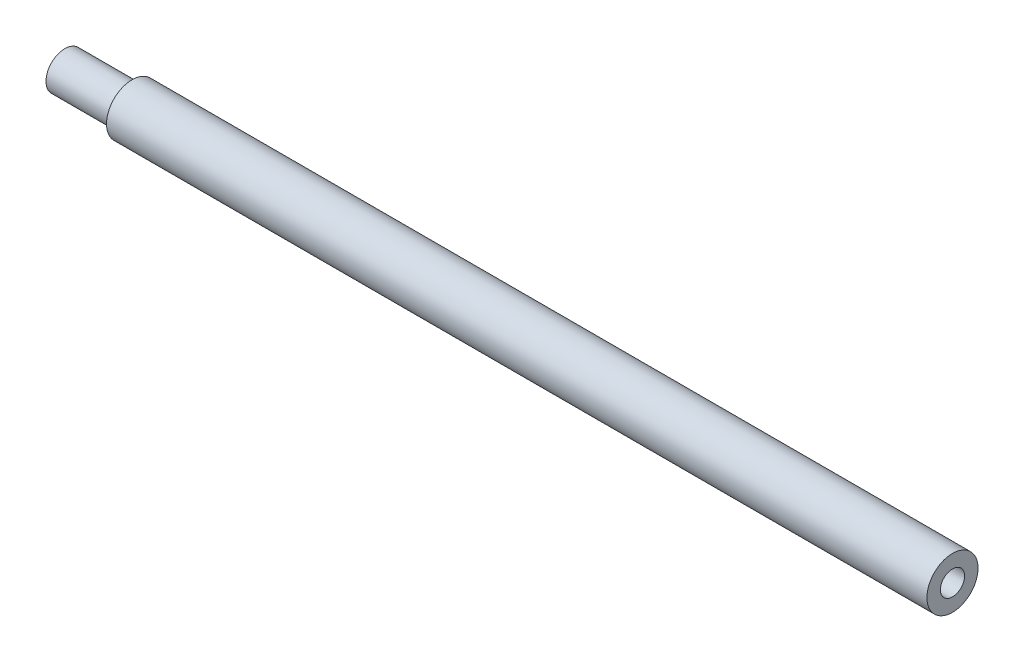
ISO-10303-21;
HEADER;
FILE_DESCRIPTION(('STEP AP214'),'2;1');
FILE_NAME('part.step','',(''),(''),'','','');
FILE_SCHEMA(('AUTOMOTIVE_DESIGN { 1 0 10303 214 1 1 1 1 }'));
ENDSEC;
DATA;
#1=APPLICATION_CONTEXT('core data for automotive mechanical design processes');
#2=APPLICATION_PROTOCOL_DEFINITION('international standard','automotive_design',2000,#1);
#3=PRODUCT_CONTEXT('',#1,'mechanical');
#4=PRODUCT('Part','Part','',(#3));
#5=PRODUCT_RELATED_PRODUCT_CATEGORY('part','',(#4));
#6=PRODUCT_DEFINITION_FORMATION('','',#4);
#7=PRODUCT_DEFINITION_CONTEXT('part definition',#1,'design');
#8=PRODUCT_DEFINITION('design','',#6,#7);
#9=PRODUCT_DEFINITION_SHAPE('','',#8);
#10=(LENGTH_UNIT() NAMED_UNIT(*) SI_UNIT(.MILLI.,.METRE.));
#11=(NAMED_UNIT(*) PLANE_ANGLE_UNIT() SI_UNIT($,.RADIAN.));
#12=(NAMED_UNIT(*) SI_UNIT($,.STERADIAN.) SOLID_ANGLE_UNIT());
#13=UNCERTAINTY_MEASURE_WITH_UNIT(LENGTH_MEASURE(1.E-05),#10,'distance_accuracy_value','');
#14=(GEOMETRIC_REPRESENTATION_CONTEXT(3) GLOBAL_UNCERTAINTY_ASSIGNED_CONTEXT((#13)) GLOBAL_UNIT_ASSIGNED_CONTEXT((#10,
#11,#12)) REPRESENTATION_CONTEXT('',''));
#15=CARTESIAN_POINT('',(0.,0.,0.));
#16=DIRECTION('',(0.,0.,1.));
#17=DIRECTION('',(1.,0.,0.));
#18=AXIS2_PLACEMENT_3D('',#15,#16,#17);
#19=CARTESIAN_POINT('',(0.,-0.7,0.));
#20=DIRECTION('',(-1.,0.,0.));
#21=DIRECTION('',(0.,0.,1.));
#22=AXIS2_PLACEMENT_3D('',#19,#20,#21);
#23=PLANE('',#22);
#24=CARTESIAN_POINT('',(0.,0.,0.));
#25=DIRECTION('',(-1.,0.,0.));
#26=DIRECTION('',(0.,0.,1.));
#27=AXIS2_PLACEMENT_3D('',#24,#25,#26);
#28=CIRCLE('',#27,0.7);
#29=CARTESIAN_POINT('',(0.,0.,0.7));
#30=VERTEX_POINT('',#29);
#31=EDGE_CURVE('E70',#30,#30,#28,.T.);
#32=ORIENTED_EDGE('',*,*,#31,.T.);
#33=EDGE_LOOP('',(#32));
#34=FACE_BOUND('',#33,.T.);
#35=CARTESIAN_POINT('',(0.,0.,0.));
#36=DIRECTION('',(-1.,0.,0.));
#37=DIRECTION('',(0.,0.,1.));
#38=AXIS2_PLACEMENT_3D('',#35,#36,#37);
#39=CIRCLE('',#38,0.45);
#40=CARTESIAN_POINT('',(0.,0.,0.45));
#41=VERTEX_POINT('',#40);
#42=EDGE_CURVE('E10',#41,#41,#39,.T.);
#43=ORIENTED_EDGE('',*,*,#42,.F.);
#44=EDGE_LOOP('',(#43));
#45=FACE_BOUND('',#44,.T.);
#46=ADVANCED_FACE('F43',(#34,#45),#23,.T.);
#47=CARTESIAN_POINT('',(-88.99,0.,0.));
#48=DIRECTION('',(-1.,0.,0.));
#49=DIRECTION('',(0.,0.,1.));
#50=AXIS2_PLACEMENT_3D('',#47,#48,#49);
#51=CYLINDRICAL_SURFACE('',#50,0.45);
#52=ORIENTED_EDGE('',*,*,#42,.T.);
#53=EDGE_LOOP('',(#52));
#54=FACE_BOUND('',#53,.T.);
#55=CARTESIAN_POINT('',(33.,0.,0.));
#56=DIRECTION('',(-1.,0.,0.));
#57=DIRECTION('',(0.,0.,1.));
#58=AXIS2_PLACEMENT_3D('',#55,#56,#57);
#59=CIRCLE('',#58,0.45);
#60=CARTESIAN_POINT('',(33.,0.,0.45));
#61=VERTEX_POINT('',#60);
#62=EDGE_CURVE('E50',#61,#61,#59,.T.);
#63=ORIENTED_EDGE('',*,*,#62,.F.);
#64=EDGE_LOOP('',(#63));
#65=FACE_BOUND('',#64,.T.);
#66=ADVANCED_FACE('F89',(#54,#65),#51,.F.);
#67=CARTESIAN_POINT('',(33.,-0.45,0.));
#68=DIRECTION('',(1.,0.,0.));
#69=DIRECTION('',(0.,0.,-1.));
#70=AXIS2_PLACEMENT_3D('',#67,#68,#69);
#71=PLANE('',#70);
#72=ORIENTED_EDGE('',*,*,#62,.T.);
#73=EDGE_LOOP('',(#72));
#74=FACE_BOUND('',#73,.T.);
#75=CARTESIAN_POINT('',(33.,0.,0.));
#76=DIRECTION('',(-1.,0.,0.));
#77=DIRECTION('',(0.,0.,1.));
#78=AXIS2_PLACEMENT_3D('',#75,#76,#77);
#79=CIRCLE('',#78,0.949999999999996);
#80=CARTESIAN_POINT('',(33.,0.,0.949999999999996));
#81=VERTEX_POINT('',#80);
#82=EDGE_CURVE('E55',#81,#81,#79,.T.);
#83=ORIENTED_EDGE('',*,*,#82,.F.);
#84=EDGE_LOOP('',(#83));
#85=FACE_BOUND('',#84,.T.);
#86=ADVANCED_FACE('F93',(#74,#85),#71,.T.);
#87=CARTESIAN_POINT('',(-88.99,0.,0.));
#88=DIRECTION('',(-1.,0.,0.));
#89=DIRECTION('',(0.,0.,1.));
#90=AXIS2_PLACEMENT_3D('',#87,#88,#89);
#91=CYLINDRICAL_SURFACE('',#90,0.949999999999998);
#92=ORIENTED_EDGE('',*,*,#82,.T.);
#93=EDGE_LOOP('',(#92));
#94=FACE_BOUND('',#93,.T.);
#95=CARTESIAN_POINT('',(2.5,0.,0.));
#96=DIRECTION('',(-1.,0.,0.));
#97=DIRECTION('',(0.,0.,1.));
#98=AXIS2_PLACEMENT_3D('',#95,#96,#97);
#99=CIRCLE('',#98,0.95);
#100=CARTESIAN_POINT('',(2.5,0.,0.95));
#101=VERTEX_POINT('',#100);
#102=EDGE_CURVE('E60',#101,#101,#99,.T.);
#103=ORIENTED_EDGE('',*,*,#102,.F.);
#104=EDGE_LOOP('',(#103));
#105=FACE_BOUND('',#104,.T.);
#106=ADVANCED_FACE('F85',(#94,#105),#91,.T.);
#107=CARTESIAN_POINT('',(2.5,-0.95,0.));
#108=DIRECTION('',(-1.,0.,0.));
#109=DIRECTION('',(0.,0.,1.));
#110=AXIS2_PLACEMENT_3D('',#107,#108,#109);
#111=PLANE('',#110);
#112=ORIENTED_EDGE('',*,*,#102,.T.);
#113=EDGE_LOOP('',(#112));
#114=FACE_BOUND('',#113,.T.);
#115=CARTESIAN_POINT('',(2.5,0.,0.));
#116=DIRECTION('',(-1.,0.,0.));
#117=DIRECTION('',(0.,0.,1.));
#118=AXIS2_PLACEMENT_3D('',#115,#116,#117);
#119=CIRCLE('',#118,0.7);
#120=CARTESIAN_POINT('',(2.5,0.,0.7));
#121=VERTEX_POINT('',#120);
#122=EDGE_CURVE('E66',#121,#121,#119,.T.);
#123=ORIENTED_EDGE('',*,*,#122,.F.);
#124=EDGE_LOOP('',(#123));
#125=FACE_BOUND('',#124,.T.);
#126=ADVANCED_FACE('F79',(#114,#125),#111,.T.);
#127=CARTESIAN_POINT('',(-88.99,0.,0.));
#128=DIRECTION('',(-1.,0.,0.));
#129=DIRECTION('',(0.,0.,1.));
#130=AXIS2_PLACEMENT_3D('',#127,#128,#129);
#131=CYLINDRICAL_SURFACE('',#130,0.7);
#132=ORIENTED_EDGE('',*,*,#122,.T.);
#133=EDGE_LOOP('',(#132));
#134=FACE_BOUND('',#133,.T.);
#135=ORIENTED_EDGE('',*,*,#31,.F.);
#136=EDGE_LOOP('',(#135));
#137=FACE_BOUND('',#136,.T.);
#138=ADVANCED_FACE('F77',(#134,#137),#131,.T.);
#139=CLOSED_SHELL('',(#46,#66,#86,#106,#126,#138));
#140=MANIFOLD_SOLID_BREP('B2',#139);
#141=ADVANCED_BREP_SHAPE_REPRESENTATION('',(#18,#140),#14);
#142=SHAPE_DEFINITION_REPRESENTATION(#9,#141);
ENDSEC;
END-ISO-10303-21;
